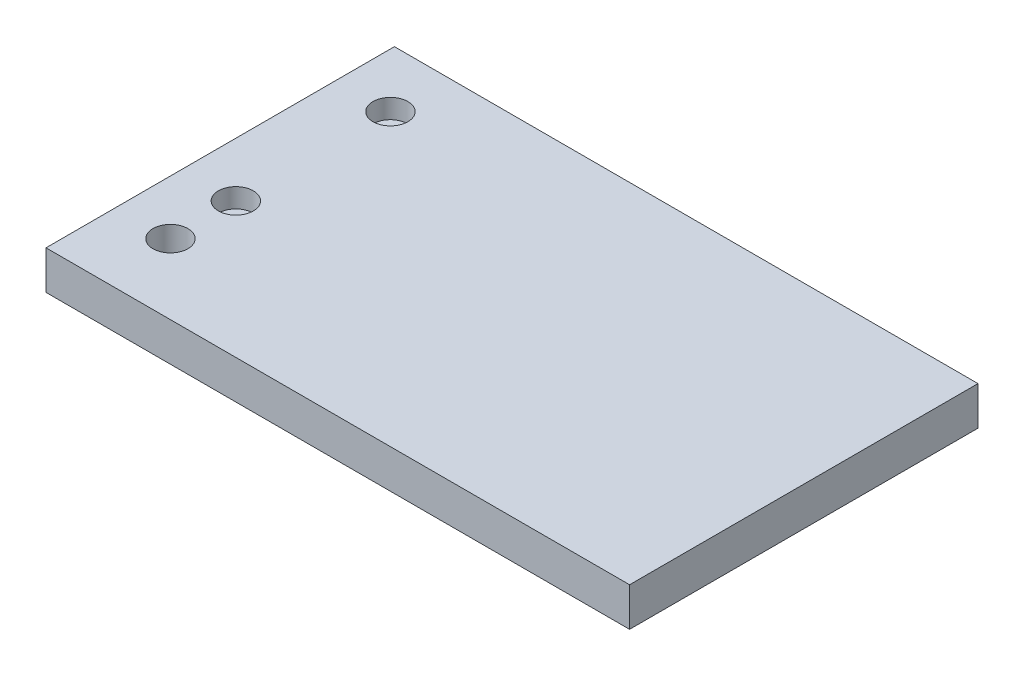
ISO-10303-21;
HEADER;
FILE_DESCRIPTION(('STEP AP214'),'2;1');
FILE_NAME('part.step','',(''),(''),'','','');
FILE_SCHEMA(('AUTOMOTIVE_DESIGN { 1 0 10303 214 1 1 1 1 }'));
ENDSEC;
DATA;
#1=APPLICATION_CONTEXT('core data for automotive mechanical design processes');
#2=APPLICATION_PROTOCOL_DEFINITION('international standard','automotive_design',2000,#1);
#3=PRODUCT_CONTEXT('',#1,'mechanical');
#4=PRODUCT('Part','Part','',(#3));
#5=PRODUCT_RELATED_PRODUCT_CATEGORY('part','',(#4));
#6=PRODUCT_DEFINITION_FORMATION('','',#4);
#7=PRODUCT_DEFINITION_CONTEXT('part definition',#1,'design');
#8=PRODUCT_DEFINITION('design','',#6,#7);
#9=PRODUCT_DEFINITION_SHAPE('','',#8);
#10=(LENGTH_UNIT() NAMED_UNIT(*) SI_UNIT(.MILLI.,.METRE.));
#11=(NAMED_UNIT(*) PLANE_ANGLE_UNIT() SI_UNIT($,.RADIAN.));
#12=(NAMED_UNIT(*) SI_UNIT($,.STERADIAN.) SOLID_ANGLE_UNIT());
#13=UNCERTAINTY_MEASURE_WITH_UNIT(LENGTH_MEASURE(1.E-05),#10,'distance_accuracy_value','');
#14=(GEOMETRIC_REPRESENTATION_CONTEXT(3) GLOBAL_UNCERTAINTY_ASSIGNED_CONTEXT((#13)) GLOBAL_UNIT_ASSIGNED_CONTEXT((#10,
#11,#12)) REPRESENTATION_CONTEXT('',''));
#15=CARTESIAN_POINT('',(0.,0.,0.));
#16=DIRECTION('',(0.,0.,1.));
#17=DIRECTION('',(1.,0.,0.));
#18=AXIS2_PLACEMENT_3D('',#15,#16,#17);
#19=CARTESIAN_POINT('',(-70.7379527765966,10.,-38.9905967818436));
#20=DIRECTION('',(1.,0.,0.));
#21=DIRECTION('',(0.,0.,-1.));
#22=AXIS2_PLACEMENT_3D('',#19,#20,#21);
#23=PLANE('',#22);
#24=DIRECTION('',(0.,0.,1.));
#25=VECTOR('',#24,1.);
#26=CARTESIAN_POINT('',(-70.7379527765966,0.,-38.9905967818436));
#27=LINE('',#26,#25);
#28=CARTESIAN_POINT('',(-70.7379527765966,0.,-38.9905967818436));
#29=VERTEX_POINT('',#28);
#30=CARTESIAN_POINT('',(-70.7379527765966,0.,51.1711226861848));
#31=VERTEX_POINT('',#30);
#32=EDGE_CURVE('E104',#29,#31,#27,.T.);
#33=ORIENTED_EDGE('',*,*,#32,.T.);
#34=DIRECTION('',(0.,-1.,0.));
#35=VECTOR('',#34,1.);
#36=CARTESIAN_POINT('',(-70.7379527765966,10.,51.1711226861848));
#37=LINE('',#36,#35);
#38=CARTESIAN_POINT('',(-70.7379527765966,10.,51.1711226861848));
#39=VERTEX_POINT('',#38);
#40=EDGE_CURVE('E11',#39,#31,#37,.T.);
#41=ORIENTED_EDGE('',*,*,#40,.F.);
#42=DIRECTION('',(0.,0.,1.));
#43=VECTOR('',#42,1.);
#44=CARTESIAN_POINT('',(-70.7379527765966,10.,-38.9905967818436));
#45=LINE('',#44,#43);
#46=CARTESIAN_POINT('',(-70.7379527765966,10.,-38.9905967818436));
#47=VERTEX_POINT('',#46);
#48=EDGE_CURVE('E91',#47,#39,#45,.T.);
#49=ORIENTED_EDGE('',*,*,#48,.F.);
#50=DIRECTION('',(0.,-1.,0.));
#51=VECTOR('',#50,1.);
#52=CARTESIAN_POINT('',(-70.7379527765966,10.,-38.9905967818436));
#53=LINE('',#52,#51);
#54=EDGE_CURVE('E100',#47,#29,#53,.T.);
#55=ORIENTED_EDGE('',*,*,#54,.T.);
#56=EDGE_LOOP('',(#33,#41,#49,#55));
#57=FACE_BOUND('',#56,.T.);
#58=ADVANCED_FACE('F38',(#57),#23,.F.);
#59=CARTESIAN_POINT('',(-70.7379527765966,10.,51.1711226861848));
#60=DIRECTION('',(0.,0.,-1.));
#61=DIRECTION('',(-1.,0.,0.));
#62=AXIS2_PLACEMENT_3D('',#59,#60,#61);
#63=PLANE('',#62);
#64=DIRECTION('',(1.,0.,0.));
#65=VECTOR('',#64,1.);
#66=CARTESIAN_POINT('',(-70.7379527765966,0.,51.1711226861848));
#67=LINE('',#66,#65);
#68=CARTESIAN_POINT('',(80.2778465467782,0.,51.1711226861848));
#69=VERTEX_POINT('',#68);
#70=EDGE_CURVE('E95',#31,#69,#67,.T.);
#71=ORIENTED_EDGE('',*,*,#70,.T.);
#72=DIRECTION('',(0.,-1.,0.));
#73=VECTOR('',#72,1.);
#74=CARTESIAN_POINT('',(80.2778465467782,10.,51.1711226861848));
#75=LINE('',#74,#73);
#76=CARTESIAN_POINT('',(80.2778465467782,10.,51.1711226861848));
#77=VERTEX_POINT('',#76);
#78=EDGE_CURVE('E47',#77,#69,#75,.T.);
#79=ORIENTED_EDGE('',*,*,#78,.F.);
#80=DIRECTION('',(1.,0.,0.));
#81=VECTOR('',#80,1.);
#82=CARTESIAN_POINT('',(-70.7379527765966,10.,51.1711226861848));
#83=LINE('',#82,#81);
#84=EDGE_CURVE('E86',#39,#77,#83,.T.);
#85=ORIENTED_EDGE('',*,*,#84,.F.);
#86=ORIENTED_EDGE('',*,*,#40,.T.);
#87=EDGE_LOOP('',(#71,#79,#85,#86));
#88=FACE_BOUND('',#87,.T.);
#89=ADVANCED_FACE('F94',(#88),#63,.F.);
#90=CARTESIAN_POINT('',(80.2778465467782,10.,-38.9905967818436));
#91=DIRECTION('',(-1.,0.,0.));
#92=DIRECTION('',(0.,0.,1.));
#93=AXIS2_PLACEMENT_3D('',#90,#91,#92);
#94=PLANE('',#93);
#95=DIRECTION('',(0.,0.,-1.));
#96=VECTOR('',#95,1.);
#97=CARTESIAN_POINT('',(80.2778465467782,0.,-38.9905967818436));
#98=LINE('',#97,#96);
#99=CARTESIAN_POINT('',(80.2778465467782,0.,-38.9905967818436));
#100=VERTEX_POINT('',#99);
#101=EDGE_CURVE('E73',#69,#100,#98,.T.);
#102=ORIENTED_EDGE('',*,*,#101,.T.);
#103=DIRECTION('',(0.,-1.,0.));
#104=VECTOR('',#103,1.);
#105=CARTESIAN_POINT('',(80.2778465467782,10.,-38.9905967818436));
#106=LINE('',#105,#104);
#107=CARTESIAN_POINT('',(80.2778465467782,10.,-38.9905967818436));
#108=VERTEX_POINT('',#107);
#109=EDGE_CURVE('E96',#108,#100,#106,.T.);
#110=ORIENTED_EDGE('',*,*,#109,.F.);
#111=DIRECTION('',(0.,0.,-1.));
#112=VECTOR('',#111,1.);
#113=CARTESIAN_POINT('',(80.2778465467782,10.,-38.9905967818436));
#114=LINE('',#113,#112);
#115=EDGE_CURVE('E89',#77,#108,#114,.T.);
#116=ORIENTED_EDGE('',*,*,#115,.F.);
#117=ORIENTED_EDGE('',*,*,#78,.T.);
#118=EDGE_LOOP('',(#102,#110,#116,#117));
#119=FACE_BOUND('',#118,.T.);
#120=ADVANCED_FACE('F98',(#119),#94,.F.);
#121=CARTESIAN_POINT('',(-70.7379527765966,10.,-38.9905967818436));
#122=DIRECTION('',(0.,0.,1.));
#123=DIRECTION('',(1.,0.,0.));
#124=AXIS2_PLACEMENT_3D('',#121,#122,#123);
#125=PLANE('',#124);
#126=DIRECTION('',(-1.,0.,0.));
#127=VECTOR('',#126,1.);
#128=CARTESIAN_POINT('',(-70.7379527765966,0.,-38.9905967818436));
#129=LINE('',#128,#127);
#130=EDGE_CURVE('E79',#100,#29,#129,.T.);
#131=ORIENTED_EDGE('',*,*,#130,.T.);
#132=ORIENTED_EDGE('',*,*,#54,.F.);
#133=DIRECTION('',(-1.,0.,0.));
#134=VECTOR('',#133,1.);
#135=CARTESIAN_POINT('',(-70.7379527765966,10.,-38.9905967818436));
#136=LINE('',#135,#134);
#137=EDGE_CURVE('E56',#108,#47,#136,.T.);
#138=ORIENTED_EDGE('',*,*,#137,.F.);
#139=ORIENTED_EDGE('',*,*,#109,.T.);
#140=EDGE_LOOP('',(#131,#132,#138,#139));
#141=FACE_BOUND('',#140,.T.);
#142=ADVANCED_FACE('F142',(#141),#125,.F.);
#143=CARTESIAN_POINT('',(-70.7379527765966,10.,51.1711226861848));
#144=DIRECTION('',(0.,1.,0.));
#145=DIRECTION('',(0.,0.,1.));
#146=AXIS2_PLACEMENT_3D('',#143,#144,#145);
#147=PLANE('',#146);
#148=CARTESIAN_POINT('',(-56.6863273557487,10.,-23.9097370478294));
#149=DIRECTION('',(0.,1.,0.));
#150=DIRECTION('',(0.,0.,1.));
#151=AXIS2_PLACEMENT_3D('',#148,#149,#150);
#152=CIRCLE('',#151,4.52251126361359);
#153=CARTESIAN_POINT('',(-56.6863273557487,10.,-19.3872257842158));
#154=VERTEX_POINT('',#153);
#155=EDGE_CURVE('E41',#154,#154,#152,.T.);
#156=ORIENTED_EDGE('',*,*,#155,.F.);
#157=EDGE_LOOP('',(#156));
#158=FACE_BOUND('',#157,.T.);
#159=CARTESIAN_POINT('',(-56.6863273557487,10.,16.0902629521706));
#160=DIRECTION('',(0.,1.,0.));
#161=DIRECTION('',(0.,0.,1.));
#162=AXIS2_PLACEMENT_3D('',#159,#160,#161);
#163=CIRCLE('',#162,4.52251126361359);
#164=CARTESIAN_POINT('',(-56.6863273557487,10.,20.6127742157842));
#165=VERTEX_POINT('',#164);
#166=EDGE_CURVE('E112',#165,#165,#163,.T.);
#167=ORIENTED_EDGE('',*,*,#166,.F.);
#168=EDGE_LOOP('',(#167));
#169=FACE_BOUND('',#168,.T.);
#170=CARTESIAN_POINT('',(-56.6863273557487,10.,33.0198987182371));
#171=DIRECTION('',(0.,1.,0.));
#172=DIRECTION('',(0.,0.,1.));
#173=AXIS2_PLACEMENT_3D('',#170,#171,#172);
#174=CIRCLE('',#173,4.52251126361359);
#175=CARTESIAN_POINT('',(-56.6863273557487,10.,37.5424099818507));
#176=VERTEX_POINT('',#175);
#177=EDGE_CURVE('E114',#176,#176,#174,.T.);
#178=ORIENTED_EDGE('',*,*,#177,.F.);
#179=EDGE_LOOP('',(#178));
#180=FACE_BOUND('',#179,.T.);
#181=ORIENTED_EDGE('',*,*,#48,.T.);
#182=ORIENTED_EDGE('',*,*,#84,.T.);
#183=ORIENTED_EDGE('',*,*,#115,.T.);
#184=ORIENTED_EDGE('',*,*,#137,.T.);
#185=EDGE_LOOP('',(#181,#182,#183,#184));
#186=FACE_BOUND('',#185,.T.);
#187=ADVANCED_FACE('F87',(#158,#169,#180,#186),#147,.T.);
#188=CARTESIAN_POINT('',(-70.7379527765966,0.,51.1711226861848));
#189=DIRECTION('',(0.,1.,0.));
#190=DIRECTION('',(0.,0.,1.));
#191=AXIS2_PLACEMENT_3D('',#188,#189,#190);
#192=PLANE('',#191);
#193=CARTESIAN_POINT('',(-56.6863273557487,0.,33.0198987182371));
#194=DIRECTION('',(0.,1.,0.));
#195=DIRECTION('',(0.,0.,1.));
#196=AXIS2_PLACEMENT_3D('',#193,#194,#195);
#197=CIRCLE('',#196,4.52251126361359);
#198=CARTESIAN_POINT('',(-56.6863273557487,0.,37.5424099818507));
#199=VERTEX_POINT('',#198);
#200=EDGE_CURVE('E107',#199,#199,#197,.T.);
#201=ORIENTED_EDGE('',*,*,#200,.T.);
#202=EDGE_LOOP('',(#201));
#203=FACE_BOUND('',#202,.T.);
#204=ORIENTED_EDGE('',*,*,#32,.F.);
#205=ORIENTED_EDGE('',*,*,#130,.F.);
#206=ORIENTED_EDGE('',*,*,#101,.F.);
#207=ORIENTED_EDGE('',*,*,#70,.F.);
#208=EDGE_LOOP('',(#204,#205,#206,#207));
#209=FACE_BOUND('',#208,.T.);
#210=ADVANCED_FACE('F131',(#203,#209),#192,.F.);
#211=CARTESIAN_POINT('',(-56.6863273557487,0.,33.0198987182371));
#212=DIRECTION('',(0.,1.,0.));
#213=DIRECTION('',(0.,0.,1.));
#214=AXIS2_PLACEMENT_3D('',#211,#212,#213);
#215=CYLINDRICAL_SURFACE('',#214,4.52251126361359);
#216=ORIENTED_EDGE('',*,*,#200,.F.);
#217=EDGE_LOOP('',(#216));
#218=FACE_BOUND('',#217,.T.);
#219=ORIENTED_EDGE('',*,*,#177,.T.);
#220=EDGE_LOOP('',(#219));
#221=FACE_BOUND('',#220,.T.);
#222=ADVANCED_FACE('F134',(#218,#221),#215,.F.);
#223=CARTESIAN_POINT('',(-56.6863273557487,5.,16.0902629521706));
#224=DIRECTION('',(0.,1.,0.));
#225=DIRECTION('',(0.,0.,1.));
#226=AXIS2_PLACEMENT_3D('',#223,#224,#225);
#227=CYLINDRICAL_SURFACE('',#226,4.52251126361359);
#228=ORIENTED_EDGE('',*,*,#166,.T.);
#229=EDGE_LOOP('',(#228));
#230=FACE_BOUND('',#229,.T.);
#231=CARTESIAN_POINT('',(-56.6863273557487,5.,16.0902629521706));
#232=DIRECTION('',(0.,1.,0.));
#233=DIRECTION('',(0.,0.,1.));
#234=AXIS2_PLACEMENT_3D('',#231,#232,#233);
#235=CIRCLE('',#234,4.52251126361359);
#236=CARTESIAN_POINT('',(-56.6863273557487,5.,20.6127742157842));
#237=VERTEX_POINT('',#236);
#238=EDGE_CURVE('E115',#237,#237,#235,.T.);
#239=ORIENTED_EDGE('',*,*,#238,.F.);
#240=EDGE_LOOP('',(#239));
#241=FACE_BOUND('',#240,.T.);
#242=ADVANCED_FACE('F137',(#230,#241),#227,.F.);
#243=CARTESIAN_POINT('',(-56.6863273557487,5.,16.0902629521706));
#244=DIRECTION('',(0.,1.,0.));
#245=DIRECTION('',(0.,0.,1.));
#246=AXIS2_PLACEMENT_3D('',#243,#244,#245);
#247=PLANE('',#246);
#248=ORIENTED_EDGE('',*,*,#238,.T.);
#249=EDGE_LOOP('',(#248));
#250=FACE_BOUND('',#249,.T.);
#251=ADVANCED_FACE('F194',(#250),#247,.T.);
#252=CARTESIAN_POINT('',(-56.6863273557487,5.,-23.9097370478294));
#253=DIRECTION('',(0.,1.,0.));
#254=DIRECTION('',(0.,0.,1.));
#255=AXIS2_PLACEMENT_3D('',#252,#253,#254);
#256=CYLINDRICAL_SURFACE('',#255,4.52251126361359);
#257=ORIENTED_EDGE('',*,*,#155,.T.);
#258=EDGE_LOOP('',(#257));
#259=FACE_BOUND('',#258,.T.);
#260=CARTESIAN_POINT('',(-56.6863273557487,5.,-23.9097370478294));
#261=DIRECTION('',(0.,1.,0.));
#262=DIRECTION('',(0.,0.,1.));
#263=AXIS2_PLACEMENT_3D('',#260,#261,#262);
#264=CIRCLE('',#263,4.52251126361359);
#265=CARTESIAN_POINT('',(-56.6863273557487,5.,-19.3872257842158));
#266=VERTEX_POINT('',#265);
#267=EDGE_CURVE('E125',#266,#266,#264,.T.);
#268=ORIENTED_EDGE('',*,*,#267,.F.);
#269=EDGE_LOOP('',(#268));
#270=FACE_BOUND('',#269,.T.);
#271=ADVANCED_FACE('F203',(#259,#270),#256,.F.);
#272=CARTESIAN_POINT('',(-56.6863273557487,5.,-23.9097370478294));
#273=DIRECTION('',(0.,1.,0.));
#274=DIRECTION('',(0.,0.,1.));
#275=AXIS2_PLACEMENT_3D('',#272,#273,#274);
#276=PLANE('',#275);
#277=ORIENTED_EDGE('',*,*,#267,.T.);
#278=EDGE_LOOP('',(#277));
#279=FACE_BOUND('',#278,.T.);
#280=ADVANCED_FACE('F212',(#279),#276,.T.);
#281=CLOSED_SHELL('',(#58,#89,#120,#142,#187,#210,#222,#242,#251,#271,#280));
#282=MANIFOLD_SOLID_BREP('B2',#281);
#283=ADVANCED_BREP_SHAPE_REPRESENTATION('',(#18,#282),#14);
#284=SHAPE_DEFINITION_REPRESENTATION(#9,#283);
ENDSEC;
END-ISO-10303-21;
